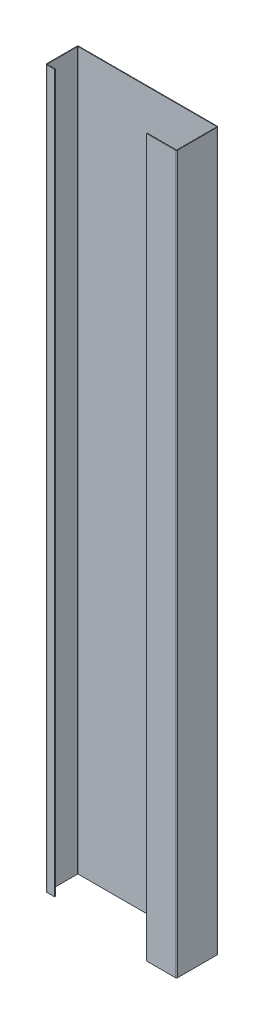
ISO-10303-21;
HEADER;
FILE_DESCRIPTION(('STEP AP214'),'2;1');
FILE_NAME('part.step','',(''),(''),'','','');
FILE_SCHEMA(('AUTOMOTIVE_DESIGN { 1 0 10303 214 1 1 1 1 }'));
ENDSEC;
DATA;
#1=APPLICATION_CONTEXT('core data for automotive mechanical design processes');
#2=APPLICATION_PROTOCOL_DEFINITION('international standard','automotive_design',2000,#1);
#3=PRODUCT_CONTEXT('',#1,'mechanical');
#4=PRODUCT('Part','Part','',(#3));
#5=PRODUCT_RELATED_PRODUCT_CATEGORY('part','',(#4));
#6=PRODUCT_DEFINITION_FORMATION('','',#4);
#7=PRODUCT_DEFINITION_CONTEXT('part definition',#1,'design');
#8=PRODUCT_DEFINITION('design','',#6,#7);
#9=PRODUCT_DEFINITION_SHAPE('','',#8);
#10=(LENGTH_UNIT() NAMED_UNIT(*) SI_UNIT(.MILLI.,.METRE.));
#11=(NAMED_UNIT(*) PLANE_ANGLE_UNIT() SI_UNIT($,.RADIAN.));
#12=(NAMED_UNIT(*) SI_UNIT($,.STERADIAN.) SOLID_ANGLE_UNIT());
#13=UNCERTAINTY_MEASURE_WITH_UNIT(LENGTH_MEASURE(1.E-05),#10,'distance_accuracy_value','');
#14=(GEOMETRIC_REPRESENTATION_CONTEXT(3) GLOBAL_UNCERTAINTY_ASSIGNED_CONTEXT((#13)) GLOBAL_UNIT_ASSIGNED_CONTEXT((#10,
#11,#12)) REPRESENTATION_CONTEXT('',''));
#15=CARTESIAN_POINT('',(0.,0.,0.));
#16=DIRECTION('',(0.,0.,1.));
#17=DIRECTION('',(1.,0.,0.));
#18=AXIS2_PLACEMENT_3D('',#15,#16,#17);
#19=CARTESIAN_POINT('',(0.,0.,-1.));
#20=DIRECTION('',(0.,0.,1.));
#21=DIRECTION('',(1.,0.,0.));
#22=AXIS2_PLACEMENT_3D('',#19,#20,#21);
#23=PLANE('',#22);
#24=DIRECTION('',(0.,1.,0.));
#25=VECTOR('',#24,1.);
#26=CARTESIAN_POINT('',(-905.132238629283,1863.16199376947,-0.999999999999897));
#27=LINE('',#26,#25);
#28=CARTESIAN_POINT('',(-905.132238629283,1863.16199376947,-0.999999999999897));
#29=VERTEX_POINT('',#28);
#30=CARTESIAN_POINT('',(-905.132238629283,663.16199376947,-1.));
#31=VERTEX_POINT('',#30);
#32=EDGE_CURVE('E347',#29,#31,#27,.F.);
#33=ORIENTED_EDGE('',*,*,#32,.T.);
#34=DIRECTION('',(1.,0.,0.));
#35=VECTOR('',#34,1.);
#36=CARTESIAN_POINT('',(-1138.39563862928,663.16199376947,-1.));
#37=LINE('',#36,#35);
#38=CARTESIAN_POINT('',(-1136.65903862928,663.16199376947,-1.));
#39=VERTEX_POINT('',#38);
#40=EDGE_CURVE('E130',#39,#31,#37,.T.);
#41=ORIENTED_EDGE('',*,*,#40,.F.);
#42=DIRECTION('',(0.,-1.,0.));
#43=VECTOR('',#42,1.);
#44=CARTESIAN_POINT('',(-1136.65903862928,663.16199376947,-1.));
#45=LINE('',#44,#43);
#46=CARTESIAN_POINT('',(-1136.65903862928,1863.16199376947,-1.));
#47=VERTEX_POINT('',#46);
#48=EDGE_CURVE('E443',#39,#47,#45,.F.);
#49=ORIENTED_EDGE('',*,*,#48,.T.);
#50=DIRECTION('',(-1.,0.,0.));
#51=VECTOR('',#50,1.);
#52=CARTESIAN_POINT('',(-1138.39563862928,1863.16199376947,-1.));
#53=LINE('',#52,#51);
#54=EDGE_CURVE('E13',#29,#47,#53,.T.);
#55=ORIENTED_EDGE('',*,*,#54,.F.);
#56=EDGE_LOOP('',(#33,#41,#49,#55));
#57=FACE_BOUND('',#56,.T.);
#58=ADVANCED_FACE('F121',(#57),#23,.F.);
#59=CARTESIAN_POINT('',(0.,0.,0.));
#60=DIRECTION('',(0.,0.,1.));
#61=DIRECTION('',(1.,0.,0.));
#62=AXIS2_PLACEMENT_3D('',#59,#60,#61);
#63=PLANE('',#62);
#64=DIRECTION('',(1.,0.,0.));
#65=VECTOR('',#64,1.);
#66=CARTESIAN_POINT('',(-1138.39563862928,663.16199376947,0.));
#67=LINE('',#66,#65);
#68=CARTESIAN_POINT('',(-1136.65903862928,663.16199376947,0.));
#69=VERTEX_POINT('',#68);
#70=CARTESIAN_POINT('',(-905.132238629283,663.16199376947,0.));
#71=VERTEX_POINT('',#70);
#72=EDGE_CURVE('E461',#69,#71,#67,.T.);
#73=ORIENTED_EDGE('',*,*,#72,.T.);
#74=DIRECTION('',(0.,1.,0.));
#75=VECTOR('',#74,1.);
#76=CARTESIAN_POINT('',(-905.132238629283,1863.16199376947,1.03432887255117E-13));
#77=LINE('',#76,#75);
#78=CARTESIAN_POINT('',(-905.132238629283,1863.16199376947,1.03432887255117E-13));
#79=VERTEX_POINT('',#78);
#80=EDGE_CURVE('E359',#79,#71,#77,.F.);
#81=ORIENTED_EDGE('',*,*,#80,.F.);
#82=DIRECTION('',(-1.,0.,0.));
#83=VECTOR('',#82,1.);
#84=CARTESIAN_POINT('',(-1138.39563862928,1863.16199376947,0.));
#85=LINE('',#84,#83);
#86=CARTESIAN_POINT('',(-1136.65903862928,1863.16199376947,0.));
#87=VERTEX_POINT('',#86);
#88=EDGE_CURVE('E125',#79,#87,#85,.T.);
#89=ORIENTED_EDGE('',*,*,#88,.T.);
#90=DIRECTION('',(0.,-1.,0.));
#91=VECTOR('',#90,1.);
#92=CARTESIAN_POINT('',(-1136.65903862928,663.16199376947,0.));
#93=LINE('',#92,#91);
#94=EDGE_CURVE('E138',#69,#87,#93,.F.);
#95=ORIENTED_EDGE('',*,*,#94,.F.);
#96=EDGE_LOOP('',(#73,#81,#89,#95));
#97=FACE_BOUND('',#96,.T.);
#98=ADVANCED_FACE('F466',(#97),#63,.T.);
#99=CARTESIAN_POINT('',(-1138.39563862928,1863.16199376947,-1.));
#100=DIRECTION('',(0.,1.,0.));
#101=DIRECTION('',(0.,0.,1.));
#102=AXIS2_PLACEMENT_3D('',#99,#100,#101);
#103=PLANE('',#102);
#104=ORIENTED_EDGE('',*,*,#88,.F.);
#105=DIRECTION('',(0.,0.,-1.));
#106=VECTOR('',#105,1.);
#107=CARTESIAN_POINT('',(-905.132238629283,1863.16199376947,1.03432887255117E-13));
#108=LINE('',#107,#106);
#109=EDGE_CURVE('E353',#79,#29,#108,.T.);
#110=ORIENTED_EDGE('',*,*,#109,.T.);
#111=ORIENTED_EDGE('',*,*,#54,.T.);
#112=DIRECTION('',(0.,0.,-1.));
#113=VECTOR('',#112,1.);
#114=CARTESIAN_POINT('',(-1136.65903862928,1863.16199376947,0.));
#115=LINE('',#114,#113);
#116=EDGE_CURVE('E458',#87,#47,#115,.T.);
#117=ORIENTED_EDGE('',*,*,#116,.F.);
#118=EDGE_LOOP('',(#104,#110,#111,#117));
#119=FACE_BOUND('',#118,.T.);
#120=ADVANCED_FACE('F468',(#119),#103,.T.);
#121=CARTESIAN_POINT('',(-1138.39563862928,663.16199376947,-1.));
#122=DIRECTION('',(0.,-1.,0.));
#123=DIRECTION('',(0.,0.,-1.));
#124=AXIS2_PLACEMENT_3D('',#121,#122,#123);
#125=PLANE('',#124);
#126=DIRECTION('',(0.,0.,-1.));
#127=VECTOR('',#126,1.);
#128=CARTESIAN_POINT('',(-905.132238629283,663.16199376947,0.));
#129=LINE('',#128,#127);
#130=EDGE_CURVE('E364',#71,#31,#129,.T.);
#131=ORIENTED_EDGE('',*,*,#130,.F.);
#132=ORIENTED_EDGE('',*,*,#72,.F.);
#133=DIRECTION('',(0.,0.,-1.));
#134=VECTOR('',#133,1.);
#135=CARTESIAN_POINT('',(-1136.65903862928,663.16199376947,0.));
#136=LINE('',#135,#134);
#137=EDGE_CURVE('E449',#69,#39,#136,.T.);
#138=ORIENTED_EDGE('',*,*,#137,.T.);
#139=ORIENTED_EDGE('',*,*,#40,.T.);
#140=EDGE_LOOP('',(#131,#132,#138,#139));
#141=FACE_BOUND('',#140,.T.);
#142=ADVANCED_FACE('F123',(#141),#125,.T.);
#143=CARTESIAN_POINT('',(-1136.65903862928,1863.16199376947,0.736599999999976));
#144=DIRECTION('',(0.,1.,0.));
#145=DIRECTION('',(0.,0.,1.));
#146=AXIS2_PLACEMENT_3D('',#143,#144,#145);
#147=PLANE('',#146);
#148=DIRECTION('',(1.,0.,0.));
#149=VECTOR('',#148,1.);
#150=CARTESIAN_POINT('',(-1138.39563862928,1863.16199376947,0.736599999999976));
#151=LINE('',#150,#149);
#152=CARTESIAN_POINT('',(-1137.39563862928,1863.16199376947,0.736599999999976));
#153=VERTEX_POINT('',#152);
#154=CARTESIAN_POINT('',(-1138.39563862928,1863.16199376947,0.736599999999976));
#155=VERTEX_POINT('',#154);
#156=EDGE_CURVE('E402',#153,#155,#151,.F.);
#157=ORIENTED_EDGE('',*,*,#156,.F.);
#158=CARTESIAN_POINT('',(-1136.65903862928,1863.16199376947,0.736599999999976));
#159=DIRECTION('',(0.,-1.,0.));
#160=DIRECTION('',(0.,0.,-1.));
#161=AXIS2_PLACEMENT_3D('',#158,#159,#160);
#162=CIRCLE('',#161,0.736599999999976);
#163=EDGE_CURVE('E452',#87,#153,#162,.F.);
#164=ORIENTED_EDGE('',*,*,#163,.F.);
#165=ORIENTED_EDGE('',*,*,#116,.T.);
#166=CARTESIAN_POINT('',(-1136.65903862928,1863.16199376947,0.736599999999976));
#167=DIRECTION('',(0.,-1.,0.));
#168=DIRECTION('',(0.,0.,-1.));
#169=AXIS2_PLACEMENT_3D('',#166,#167,#168);
#170=CIRCLE('',#169,1.73659999999998);
#171=EDGE_CURVE('E445',#47,#155,#170,.F.);
#172=ORIENTED_EDGE('',*,*,#171,.T.);
#173=EDGE_LOOP('',(#157,#164,#165,#172));
#174=FACE_BOUND('',#173,.T.);
#175=ADVANCED_FACE('F476',(#174),#147,.T.);
#176=CARTESIAN_POINT('',(-1136.65903862928,663.16199376947,0.736599999999976));
#177=DIRECTION('',(0.,1.,0.));
#178=DIRECTION('',(0.,0.,1.));
#179=AXIS2_PLACEMENT_3D('',#176,#177,#178);
#180=PLANE('',#179);
#181=CARTESIAN_POINT('',(-1136.65903862928,663.16199376947,0.736599999999976));
#182=DIRECTION('',(0.,-1.,0.));
#183=DIRECTION('',(0.,0.,-1.));
#184=AXIS2_PLACEMENT_3D('',#181,#182,#183);
#185=CIRCLE('',#184,0.736599999999976);
#186=CARTESIAN_POINT('',(-1137.39563862928,663.16199376947,0.736599999999976));
#187=VERTEX_POINT('',#186);
#188=EDGE_CURVE('E413',#187,#69,#185,.T.);
#189=ORIENTED_EDGE('',*,*,#188,.F.);
#190=DIRECTION('',(1.,0.,0.));
#191=VECTOR('',#190,1.);
#192=CARTESIAN_POINT('',(-1137.39563862928,663.16199376947,0.736599999999976));
#193=LINE('',#192,#191);
#194=CARTESIAN_POINT('',(-1138.39563862928,663.16199376947,0.736599999999976));
#195=VERTEX_POINT('',#194);
#196=EDGE_CURVE('E436',#187,#195,#193,.F.);
#197=ORIENTED_EDGE('',*,*,#196,.T.);
#198=CARTESIAN_POINT('',(-1136.65903862928,663.16199376947,0.736599999999976));
#199=DIRECTION('',(0.,-1.,0.));
#200=DIRECTION('',(0.,0.,-1.));
#201=AXIS2_PLACEMENT_3D('',#198,#199,#200);
#202=CIRCLE('',#201,1.73659999999998);
#203=EDGE_CURVE('E446',#195,#39,#202,.T.);
#204=ORIENTED_EDGE('',*,*,#203,.T.);
#205=ORIENTED_EDGE('',*,*,#137,.F.);
#206=EDGE_LOOP('',(#189,#197,#204,#205));
#207=FACE_BOUND('',#206,.T.);
#208=ADVANCED_FACE('F537',(#207),#180,.F.);
#209=CARTESIAN_POINT('',(-1136.65903862928,663.16199376947,0.736599999999976));
#210=DIRECTION('',(0.,-1.,0.));
#211=DIRECTION('',(-1.,0.,0.));
#212=AXIS2_PLACEMENT_3D('',#209,#210,#211);
#213=CYLINDRICAL_SURFACE('',#212,1.73659999999998);
#214=ORIENTED_EDGE('',*,*,#48,.F.);
#215=ORIENTED_EDGE('',*,*,#203,.F.);
#216=DIRECTION('',(0.,-1.,0.));
#217=VECTOR('',#216,1.);
#218=CARTESIAN_POINT('',(-1138.39563862928,1863.16199376947,0.736599999999976));
#219=LINE('',#218,#217);
#220=EDGE_CURVE('E434',#195,#155,#219,.F.);
#221=ORIENTED_EDGE('',*,*,#220,.T.);
#222=ORIENTED_EDGE('',*,*,#171,.F.);
#223=EDGE_LOOP('',(#214,#215,#221,#222));
#224=FACE_BOUND('',#223,.T.);
#225=ADVANCED_FACE('F885',(#224),#213,.T.);
#226=CARTESIAN_POINT('',(-1136.65903862928,663.16199376947,0.736599999999976));
#227=DIRECTION('',(0.,-1.,0.));
#228=DIRECTION('',(-1.,0.,0.));
#229=AXIS2_PLACEMENT_3D('',#226,#227,#228);
#230=CYLINDRICAL_SURFACE('',#229,0.736599999999976);
#231=ORIENTED_EDGE('',*,*,#94,.T.);
#232=ORIENTED_EDGE('',*,*,#163,.T.);
#233=DIRECTION('',(0.,-1.,0.));
#234=VECTOR('',#233,1.);
#235=CARTESIAN_POINT('',(-1137.39563862928,1863.16199376947,0.736599999999976));
#236=LINE('',#235,#234);
#237=EDGE_CURVE('E439',#153,#187,#236,.T.);
#238=ORIENTED_EDGE('',*,*,#237,.T.);
#239=ORIENTED_EDGE('',*,*,#188,.T.);
#240=EDGE_LOOP('',(#231,#232,#238,#239));
#241=FACE_BOUND('',#240,.T.);
#242=ADVANCED_FACE('F473',(#241),#230,.F.);
#243=CARTESIAN_POINT('',(-1138.39563862928,663.16199376947,51.));
#244=DIRECTION('',(0.,1.,0.));
#245=DIRECTION('',(0.,0.,1.));
#246=AXIS2_PLACEMENT_3D('',#243,#244,#245);
#247=PLANE('',#246);
#248=ORIENTED_EDGE('',*,*,#196,.F.);
#249=DIRECTION('',(0.,0.,-1.));
#250=VECTOR('',#249,1.);
#251=CARTESIAN_POINT('',(-1137.39563862928,663.16199376947,51.));
#252=LINE('',#251,#250);
#253=CARTESIAN_POINT('',(-1137.39563862928,663.16199376947,51.));
#254=VERTEX_POINT('',#253);
#255=EDGE_CURVE('E431',#187,#254,#252,.F.);
#256=ORIENTED_EDGE('',*,*,#255,.T.);
#257=DIRECTION('',(1.,0.,0.));
#258=VECTOR('',#257,1.);
#259=CARTESIAN_POINT('',(-1138.39563862928,663.16199376947,51.));
#260=LINE('',#259,#258);
#261=CARTESIAN_POINT('',(-1138.39563862928,663.16199376947,51.));
#262=VERTEX_POINT('',#261);
#263=EDGE_CURVE('E411',#262,#254,#260,.T.);
#264=ORIENTED_EDGE('',*,*,#263,.F.);
#265=DIRECTION('',(0.,0.,1.));
#266=VECTOR('',#265,1.);
#267=CARTESIAN_POINT('',(-1138.39563862928,663.16199376947,2.8837936737168E-12));
#268=LINE('',#267,#266);
#269=EDGE_CURVE('E423',#195,#262,#268,.T.);
#270=ORIENTED_EDGE('',*,*,#269,.F.);
#271=EDGE_LOOP('',(#248,#256,#264,#270));
#272=FACE_BOUND('',#271,.T.);
#273=ADVANCED_FACE('F867',(#272),#247,.F.);
#274=CARTESIAN_POINT('',(-1138.39563862928,1863.16199376947,0.));
#275=DIRECTION('',(0.,-1.,0.));
#276=DIRECTION('',(0.,0.,-1.));
#277=AXIS2_PLACEMENT_3D('',#274,#275,#276);
#278=PLANE('',#277);
#279=ORIENTED_EDGE('',*,*,#156,.T.);
#280=DIRECTION('',(0.,0.,-1.));
#281=VECTOR('',#280,1.);
#282=CARTESIAN_POINT('',(-1138.39563862928,1863.16199376947,8.10837261312931E-12));
#283=LINE('',#282,#281);
#284=CARTESIAN_POINT('',(-1138.39563862928,1863.16199376947,51.));
#285=VERTEX_POINT('',#284);
#286=EDGE_CURVE('E417',#285,#155,#283,.T.);
#287=ORIENTED_EDGE('',*,*,#286,.F.);
#288=DIRECTION('',(1.,0.,0.));
#289=VECTOR('',#288,1.);
#290=CARTESIAN_POINT('',(-1138.39563862928,1863.16199376947,51.));
#291=LINE('',#290,#289);
#292=CARTESIAN_POINT('',(-1137.39563862928,1863.16199376947,51.));
#293=VERTEX_POINT('',#292);
#294=EDGE_CURVE('E414',#285,#293,#291,.T.);
#295=ORIENTED_EDGE('',*,*,#294,.T.);
#296=DIRECTION('',(0.,0.,1.));
#297=VECTOR('',#296,1.);
#298=CARTESIAN_POINT('',(-1137.39563862928,1863.16199376947,0.));
#299=LINE('',#298,#297);
#300=EDGE_CURVE('E426',#293,#153,#299,.F.);
#301=ORIENTED_EDGE('',*,*,#300,.T.);
#302=EDGE_LOOP('',(#279,#287,#295,#301));
#303=FACE_BOUND('',#302,.T.);
#304=ADVANCED_FACE('F479',(#303),#278,.F.);
#305=CARTESIAN_POINT('',(-1138.39563862928,-2.10645508189848E-13,0.));
#306=DIRECTION('',(1.,0.,0.));
#307=DIRECTION('',(0.,1.,0.));
#308=AXIS2_PLACEMENT_3D('',#305,#306,#307);
#309=PLANE('',#308);
#310=ORIENTED_EDGE('',*,*,#220,.F.);
#311=ORIENTED_EDGE('',*,*,#269,.T.);
#312=DIRECTION('',(0.,1.,0.));
#313=VECTOR('',#312,1.);
#314=CARTESIAN_POINT('',(-1138.39563862928,-2.10645508189848E-13,51.));
#315=LINE('',#314,#313);
#316=EDGE_CURVE('E420',#262,#285,#315,.T.);
#317=ORIENTED_EDGE('',*,*,#316,.T.);
#318=ORIENTED_EDGE('',*,*,#286,.T.);
#319=EDGE_LOOP('',(#310,#311,#317,#318));
#320=FACE_BOUND('',#319,.T.);
#321=ADVANCED_FACE('F483',(#320),#309,.F.);
#322=CARTESIAN_POINT('',(-1137.39563862928,-2.10460471019077E-13,0.));
#323=DIRECTION('',(1.,0.,0.));
#324=DIRECTION('',(0.,1.,0.));
#325=AXIS2_PLACEMENT_3D('',#322,#323,#324);
#326=PLANE('',#325);
#327=ORIENTED_EDGE('',*,*,#255,.F.);
#328=ORIENTED_EDGE('',*,*,#237,.F.);
#329=ORIENTED_EDGE('',*,*,#300,.F.);
#330=DIRECTION('',(0.,-1.,0.));
#331=VECTOR('',#330,1.);
#332=CARTESIAN_POINT('',(-1137.39563862928,1863.16199376947,51.));
#333=LINE('',#332,#331);
#334=EDGE_CURVE('E429',#254,#293,#333,.F.);
#335=ORIENTED_EDGE('',*,*,#334,.F.);
#336=EDGE_LOOP('',(#327,#328,#329,#335));
#337=FACE_BOUND('',#336,.T.);
#338=ADVANCED_FACE('F841',(#337),#326,.T.);
#339=CARTESIAN_POINT('',(-1136.65903862928,1863.16199376947,51.));
#340=DIRECTION('',(0.,1.,0.));
#341=DIRECTION('',(0.,0.,1.));
#342=AXIS2_PLACEMENT_3D('',#339,#340,#341);
#343=PLANE('',#342);
#344=DIRECTION('',(0.,0.,-1.));
#345=VECTOR('',#344,1.);
#346=CARTESIAN_POINT('',(-1136.65903862928,1863.16199376947,52.7366));
#347=LINE('',#346,#345);
#348=CARTESIAN_POINT('',(-1136.65903862928,1863.16199376947,51.7366));
#349=VERTEX_POINT('',#348);
#350=CARTESIAN_POINT('',(-1136.65903862928,1863.16199376947,52.7366));
#351=VERTEX_POINT('',#350);
#352=EDGE_CURVE('E367',#349,#351,#347,.F.);
#353=ORIENTED_EDGE('',*,*,#352,.F.);
#354=CARTESIAN_POINT('',(-1136.65903862928,1863.16199376947,51.));
#355=DIRECTION('',(0.,-1.,0.));
#356=DIRECTION('',(0.,0.,-1.));
#357=AXIS2_PLACEMENT_3D('',#354,#355,#356);
#358=CIRCLE('',#357,0.736599999999997);
#359=EDGE_CURVE('E406',#293,#349,#358,.F.);
#360=ORIENTED_EDGE('',*,*,#359,.F.);
#361=ORIENTED_EDGE('',*,*,#294,.F.);
#362=CARTESIAN_POINT('',(-1136.65903862928,1863.16199376947,51.));
#363=DIRECTION('',(0.,-1.,0.));
#364=DIRECTION('',(0.,0.,-1.));
#365=AXIS2_PLACEMENT_3D('',#362,#363,#364);
#366=CIRCLE('',#365,1.7366);
#367=EDGE_CURVE('E399',#285,#351,#366,.F.);
#368=ORIENTED_EDGE('',*,*,#367,.T.);
#369=EDGE_LOOP('',(#353,#360,#361,#368));
#370=FACE_BOUND('',#369,.T.);
#371=ADVANCED_FACE('F512',(#370),#343,.T.);
#372=CARTESIAN_POINT('',(-1136.65903862928,663.16199376947,51.));
#373=DIRECTION('',(0.,1.,0.));
#374=DIRECTION('',(0.,0.,1.));
#375=AXIS2_PLACEMENT_3D('',#372,#373,#374);
#376=PLANE('',#375);
#377=CARTESIAN_POINT('',(-1136.65903862928,663.16199376947,51.));
#378=DIRECTION('',(0.,-1.,0.));
#379=DIRECTION('',(0.,0.,-1.));
#380=AXIS2_PLACEMENT_3D('',#377,#378,#379);
#381=CIRCLE('',#380,0.736599999999997);
#382=CARTESIAN_POINT('',(-1136.65903862928,663.16199376947,51.7366));
#383=VERTEX_POINT('',#382);
#384=EDGE_CURVE('E372',#383,#254,#381,.T.);
#385=ORIENTED_EDGE('',*,*,#384,.F.);
#386=DIRECTION('',(0.,0.,-1.));
#387=VECTOR('',#386,1.);
#388=CARTESIAN_POINT('',(-1136.65903862928,663.16199376947,51.7365999999999));
#389=LINE('',#388,#387);
#390=CARTESIAN_POINT('',(-1136.65903862928,663.16199376947,52.7366));
#391=VERTEX_POINT('',#390);
#392=EDGE_CURVE('E392',#383,#391,#389,.F.);
#393=ORIENTED_EDGE('',*,*,#392,.T.);
#394=CARTESIAN_POINT('',(-1136.65903862928,663.16199376947,51.));
#395=DIRECTION('',(0.,-1.,0.));
#396=DIRECTION('',(0.,0.,-1.));
#397=AXIS2_PLACEMENT_3D('',#394,#395,#396);
#398=CIRCLE('',#397,1.7366);
#399=EDGE_CURVE('E403',#391,#262,#398,.T.);
#400=ORIENTED_EDGE('',*,*,#399,.T.);
#401=ORIENTED_EDGE('',*,*,#263,.T.);
#402=EDGE_LOOP('',(#385,#393,#400,#401));
#403=FACE_BOUND('',#402,.T.);
#404=ADVANCED_FACE('F491',(#403),#376,.F.);
#405=CARTESIAN_POINT('',(-1136.65903862928,663.16199376947,51.));
#406=DIRECTION('',(0.,-1.,0.));
#407=DIRECTION('',(0.,0.,1.));
#408=AXIS2_PLACEMENT_3D('',#405,#406,#407);
#409=CYLINDRICAL_SURFACE('',#408,1.7366);
#410=ORIENTED_EDGE('',*,*,#316,.F.);
#411=ORIENTED_EDGE('',*,*,#399,.F.);
#412=DIRECTION('',(0.,-1.,0.));
#413=VECTOR('',#412,1.);
#414=CARTESIAN_POINT('',(-1136.65903862928,1863.16199376947,52.7366));
#415=LINE('',#414,#413);
#416=EDGE_CURVE('E390',#391,#351,#415,.F.);
#417=ORIENTED_EDGE('',*,*,#416,.T.);
#418=ORIENTED_EDGE('',*,*,#367,.F.);
#419=EDGE_LOOP('',(#410,#411,#417,#418));
#420=FACE_BOUND('',#419,.T.);
#421=ADVANCED_FACE('F487',(#420),#409,.T.);
#422=CARTESIAN_POINT('',(-1136.65903862928,663.16199376947,51.));
#423=DIRECTION('',(0.,-1.,0.));
#424=DIRECTION('',(0.,0.,1.));
#425=AXIS2_PLACEMENT_3D('',#422,#423,#424);
#426=CYLINDRICAL_SURFACE('',#425,0.736599999999997);
#427=ORIENTED_EDGE('',*,*,#334,.T.);
#428=ORIENTED_EDGE('',*,*,#359,.T.);
#429=DIRECTION('',(0.,-1.,0.));
#430=VECTOR('',#429,1.);
#431=CARTESIAN_POINT('',(-1136.65903862928,1863.16199376947,51.7366));
#432=LINE('',#431,#430);
#433=EDGE_CURVE('E395',#349,#383,#432,.T.);
#434=ORIENTED_EDGE('',*,*,#433,.T.);
#435=ORIENTED_EDGE('',*,*,#384,.T.);
#436=EDGE_LOOP('',(#427,#428,#434,#435));
#437=FACE_BOUND('',#436,.T.);
#438=ADVANCED_FACE('F515',(#437),#426,.F.);
#439=CARTESIAN_POINT('',(-1123.39563862928,663.16199376947,52.7366));
#440=DIRECTION('',(0.,1.,0.));
#441=DIRECTION('',(0.,0.,1.));
#442=AXIS2_PLACEMENT_3D('',#439,#440,#441);
#443=PLANE('',#442);
#444=ORIENTED_EDGE('',*,*,#392,.F.);
#445=DIRECTION('',(-1.,0.,0.));
#446=VECTOR('',#445,1.);
#447=CARTESIAN_POINT('',(-1123.39563862928,663.16199376947,51.7366));
#448=LINE('',#447,#446);
#449=CARTESIAN_POINT('',(-1123.39563862928,663.16199376947,51.7366));
#450=VERTEX_POINT('',#449);
#451=EDGE_CURVE('E388',#383,#450,#448,.F.);
#452=ORIENTED_EDGE('',*,*,#451,.T.);
#453=DIRECTION('',(0.,0.,-1.));
#454=VECTOR('',#453,1.);
#455=CARTESIAN_POINT('',(-1123.39563862928,663.16199376947,52.7366));
#456=LINE('',#455,#454);
#457=CARTESIAN_POINT('',(-1123.39563862928,663.16199376947,52.7366));
#458=VERTEX_POINT('',#457);
#459=EDGE_CURVE('E369',#458,#450,#456,.T.);
#460=ORIENTED_EDGE('',*,*,#459,.F.);
#461=DIRECTION('',(1.,0.,0.));
#462=VECTOR('',#461,1.);
#463=CARTESIAN_POINT('',(-1.80433275888491E-13,663.16199376947,52.7366000000039));
#464=LINE('',#463,#462);
#465=EDGE_CURVE('E381',#391,#458,#464,.T.);
#466=ORIENTED_EDGE('',*,*,#465,.F.);
#467=EDGE_LOOP('',(#444,#452,#460,#466));
#468=FACE_BOUND('',#467,.T.);
#469=ADVANCED_FACE('F501',(#468),#443,.F.);
#470=CARTESIAN_POINT('',(-1137.39563862928,1863.16199376947,52.7366));
#471=DIRECTION('',(0.,-1.,0.));
#472=DIRECTION('',(0.,0.,-1.));
#473=AXIS2_PLACEMENT_3D('',#470,#471,#472);
#474=PLANE('',#473);
#475=ORIENTED_EDGE('',*,*,#352,.T.);
#476=DIRECTION('',(-1.,0.,0.));
#477=VECTOR('',#476,1.);
#478=CARTESIAN_POINT('',(-1.80433275888491E-13,1863.16199376947,52.7366000000039));
#479=LINE('',#478,#477);
#480=CARTESIAN_POINT('',(-1123.39563862928,1863.16199376947,52.7366));
#481=VERTEX_POINT('',#480);
#482=EDGE_CURVE('E376',#481,#351,#479,.T.);
#483=ORIENTED_EDGE('',*,*,#482,.F.);
#484=DIRECTION('',(0.,0.,-1.));
#485=VECTOR('',#484,1.);
#486=CARTESIAN_POINT('',(-1123.39563862928,1863.16199376947,52.7366));
#487=LINE('',#486,#485);
#488=CARTESIAN_POINT('',(-1123.39563862928,1863.16199376947,51.7366));
#489=VERTEX_POINT('',#488);
#490=EDGE_CURVE('E373',#481,#489,#487,.T.);
#491=ORIENTED_EDGE('',*,*,#490,.T.);
#492=DIRECTION('',(1.,0.,0.));
#493=VECTOR('',#492,1.);
#494=CARTESIAN_POINT('',(-1137.39563862928,1863.16199376947,51.7366));
#495=LINE('',#494,#493);
#496=EDGE_CURVE('E383',#489,#349,#495,.F.);
#497=ORIENTED_EDGE('',*,*,#496,.T.);
#498=EDGE_LOOP('',(#475,#483,#491,#497));
#499=FACE_BOUND('',#498,.T.);
#500=ADVANCED_FACE('F509',(#499),#474,.F.);
#501=CARTESIAN_POINT('',(-1.80433275888491E-13,0.,52.7366000000039));
#502=DIRECTION('',(0.,0.,-1.));
#503=DIRECTION('',(-1.,0.,0.));
#504=AXIS2_PLACEMENT_3D('',#501,#502,#503);
#505=PLANE('',#504);
#506=ORIENTED_EDGE('',*,*,#416,.F.);
#507=ORIENTED_EDGE('',*,*,#465,.T.);
#508=DIRECTION('',(0.,1.,0.));
#509=VECTOR('',#508,1.);
#510=CARTESIAN_POINT('',(-1123.39563862928,-2.07869950628285E-13,52.7366));
#511=LINE('',#510,#509);
#512=EDGE_CURVE('E379',#458,#481,#511,.T.);
#513=ORIENTED_EDGE('',*,*,#512,.T.);
#514=ORIENTED_EDGE('',*,*,#482,.T.);
#515=EDGE_LOOP('',(#506,#507,#513,#514));
#516=FACE_BOUND('',#515,.T.);
#517=ADVANCED_FACE('F498',(#516),#505,.F.);
#518=CARTESIAN_POINT('',(-1.76941794549648E-13,0.,51.7366000000039));
#519=DIRECTION('',(0.,0.,-1.));
#520=DIRECTION('',(-1.,0.,0.));
#521=AXIS2_PLACEMENT_3D('',#518,#519,#520);
#522=PLANE('',#521);
#523=ORIENTED_EDGE('',*,*,#451,.F.);
#524=ORIENTED_EDGE('',*,*,#433,.F.);
#525=ORIENTED_EDGE('',*,*,#496,.F.);
#526=DIRECTION('',(0.,-1.,0.));
#527=VECTOR('',#526,1.);
#528=CARTESIAN_POINT('',(-1123.39563862928,1863.16199376947,51.7366));
#529=LINE('',#528,#527);
#530=EDGE_CURVE('E386',#450,#489,#529,.F.);
#531=ORIENTED_EDGE('',*,*,#530,.F.);
#532=EDGE_LOOP('',(#523,#524,#525,#531));
#533=FACE_BOUND('',#532,.T.);
#534=ADVANCED_FACE('F518',(#533),#522,.T.);
#535=CARTESIAN_POINT('',(-1123.39563862928,1863.16199376947,52.7366));
#536=DIRECTION('',(-1.,0.,0.));
#537=DIRECTION('',(0.,0.,1.));
#538=AXIS2_PLACEMENT_3D('',#535,#536,#537);
#539=PLANE('',#538);
#540=ORIENTED_EDGE('',*,*,#530,.T.);
#541=ORIENTED_EDGE('',*,*,#490,.F.);
#542=ORIENTED_EDGE('',*,*,#512,.F.);
#543=ORIENTED_EDGE('',*,*,#459,.T.);
#544=EDGE_LOOP('',(#540,#541,#542,#543));
#545=FACE_BOUND('',#544,.T.);
#546=ADVANCED_FACE('F506',(#545),#539,.F.);
#547=CARTESIAN_POINT('',(-905.132238629283,663.16199376947,0.736599999999991));
#548=DIRECTION('',(0.,-1.,0.));
#549=DIRECTION('',(0.,0.,-1.));
#550=AXIS2_PLACEMENT_3D('',#547,#548,#549);
#551=PLANE('',#550);
#552=DIRECTION('',(-1.,0.,0.));
#553=VECTOR('',#552,1.);
#554=CARTESIAN_POINT('',(-903.395638629283,663.16199376947,0.736599999999971));
#555=LINE('',#554,#553);
#556=CARTESIAN_POINT('',(-904.395638629283,663.16199376947,0.736599999999988));
#557=VERTEX_POINT('',#556);
#558=CARTESIAN_POINT('',(-903.395638629283,663.16199376947,0.736599999999982));
#559=VERTEX_POINT('',#558);
#560=EDGE_CURVE('E305',#557,#559,#555,.F.);
#561=ORIENTED_EDGE('',*,*,#560,.F.);
#562=CARTESIAN_POINT('',(-905.132238629283,663.16199376947,0.736599999999991));
#563=DIRECTION('',(0.,1.,0.));
#564=DIRECTION('',(0.,0.,1.));
#565=AXIS2_PLACEMENT_3D('',#562,#563,#564);
#566=CIRCLE('',#565,0.736599999999976);
#567=EDGE_CURVE('E356',#71,#557,#566,.F.);
#568=ORIENTED_EDGE('',*,*,#567,.F.);
#569=ORIENTED_EDGE('',*,*,#130,.T.);
#570=CARTESIAN_POINT('',(-905.132238629283,663.16199376947,0.736599999999991));
#571=DIRECTION('',(0.,1.,0.));
#572=DIRECTION('',(0.,0.,1.));
#573=AXIS2_PLACEMENT_3D('',#570,#571,#572);
#574=CIRCLE('',#573,1.73659999999998);
#575=EDGE_CURVE('E349',#31,#559,#574,.F.);
#576=ORIENTED_EDGE('',*,*,#575,.T.);
#577=EDGE_LOOP('',(#561,#568,#569,#576));
#578=FACE_BOUND('',#577,.T.);
#579=ADVANCED_FACE('F525',(#578),#551,.T.);
#580=CARTESIAN_POINT('',(-905.132238629283,1863.16199376947,0.73660000000008));
#581=DIRECTION('',(0.,-1.,0.));
#582=DIRECTION('',(0.,0.,-1.));
#583=AXIS2_PLACEMENT_3D('',#580,#581,#582);
#584=PLANE('',#583);
#585=CARTESIAN_POINT('',(-905.132238629283,1863.16199376947,0.73660000000008));
#586=DIRECTION('',(0.,1.,0.));
#587=DIRECTION('',(0.,0.,1.));
#588=AXIS2_PLACEMENT_3D('',#585,#586,#587);
#589=CIRCLE('',#588,0.736599999999976);
#590=CARTESIAN_POINT('',(-904.395638629283,1863.16199376947,0.736600000000076));
#591=VERTEX_POINT('',#590);
#592=EDGE_CURVE('E317',#591,#79,#589,.T.);
#593=ORIENTED_EDGE('',*,*,#592,.F.);
#594=DIRECTION('',(-1.,0.,0.));
#595=VECTOR('',#594,1.);
#596=CARTESIAN_POINT('',(-904.395638629283,1863.16199376947,0.736600000000087));
#597=LINE('',#596,#595);
#598=CARTESIAN_POINT('',(-903.395638629283,1863.16199376947,0.736600000000082));
#599=VERTEX_POINT('',#598);
#600=EDGE_CURVE('E340',#591,#599,#597,.F.);
#601=ORIENTED_EDGE('',*,*,#600,.T.);
#602=CARTESIAN_POINT('',(-905.132238629283,1863.16199376947,0.73660000000008));
#603=DIRECTION('',(0.,1.,0.));
#604=DIRECTION('',(0.,0.,1.));
#605=AXIS2_PLACEMENT_3D('',#602,#603,#604);
#606=CIRCLE('',#605,1.73659999999998);
#607=EDGE_CURVE('E350',#599,#29,#606,.T.);
#608=ORIENTED_EDGE('',*,*,#607,.T.);
#609=ORIENTED_EDGE('',*,*,#109,.F.);
#610=EDGE_LOOP('',(#593,#601,#608,#609));
#611=FACE_BOUND('',#610,.T.);
#612=ADVANCED_FACE('F608',(#611),#584,.F.);
#613=CARTESIAN_POINT('',(-905.132238629283,1863.16199376947,0.73660000000008));
#614=DIRECTION('',(0.,1.,0.));
#615=DIRECTION('',(1.,0.,0.));
#616=AXIS2_PLACEMENT_3D('',#613,#614,#615);
#617=CYLINDRICAL_SURFACE('',#616,1.73659999999998);
#618=ORIENTED_EDGE('',*,*,#32,.F.);
#619=ORIENTED_EDGE('',*,*,#607,.F.);
#620=DIRECTION('',(0.,1.,0.));
#621=VECTOR('',#620,1.);
#622=CARTESIAN_POINT('',(-903.395638629283,663.16199376947,0.736599999999971));
#623=LINE('',#622,#621);
#624=EDGE_CURVE('E338',#599,#559,#623,.F.);
#625=ORIENTED_EDGE('',*,*,#624,.T.);
#626=ORIENTED_EDGE('',*,*,#575,.F.);
#627=EDGE_LOOP('',(#618,#619,#625,#626));
#628=FACE_BOUND('',#627,.T.);
#629=ADVANCED_FACE('F553',(#628),#617,.T.);
#630=CARTESIAN_POINT('',(-905.132238629283,1863.16199376947,0.73660000000008));
#631=DIRECTION('',(0.,1.,0.));
#632=DIRECTION('',(1.,0.,0.));
#633=AXIS2_PLACEMENT_3D('',#630,#631,#632);
#634=CYLINDRICAL_SURFACE('',#633,0.736599999999976);
#635=ORIENTED_EDGE('',*,*,#80,.T.);
#636=ORIENTED_EDGE('',*,*,#567,.T.);
#637=DIRECTION('',(0.,1.,0.));
#638=VECTOR('',#637,1.);
#639=CARTESIAN_POINT('',(-904.395638629283,663.16199376947,0.736599999999976));
#640=LINE('',#639,#638);
#641=EDGE_CURVE('E343',#557,#591,#640,.T.);
#642=ORIENTED_EDGE('',*,*,#641,.T.);
#643=ORIENTED_EDGE('',*,*,#592,.T.);
#644=EDGE_LOOP('',(#635,#636,#642,#643));
#645=FACE_BOUND('',#644,.T.);
#646=ADVANCED_FACE('F588',(#645),#634,.F.);
#647=CARTESIAN_POINT('',(-903.395638629283,663.16199376947,0.));
#648=DIRECTION('',(0.,1.,0.));
#649=DIRECTION('',(0.,0.,1.));
#650=AXIS2_PLACEMENT_3D('',#647,#648,#649);
#651=PLANE('',#650);
#652=ORIENTED_EDGE('',*,*,#560,.T.);
#653=DIRECTION('',(0.,0.,-1.));
#654=VECTOR('',#653,1.);
#655=CARTESIAN_POINT('',(-903.395638629283,663.16199376947,5.58631393596821E-12));
#656=LINE('',#655,#654);
#657=CARTESIAN_POINT('',(-903.395638629283,663.16199376947,67.));
#658=VERTEX_POINT('',#657);
#659=EDGE_CURVE('E327',#658,#559,#656,.T.);
#660=ORIENTED_EDGE('',*,*,#659,.F.);
#661=DIRECTION('',(-1.,0.,0.));
#662=VECTOR('',#661,1.);
#663=CARTESIAN_POINT('',(-903.395638629283,663.16199376947,67.));
#664=LINE('',#663,#662);
#665=CARTESIAN_POINT('',(-904.395638629283,663.16199376947,67.));
#666=VERTEX_POINT('',#665);
#667=EDGE_CURVE('E318',#658,#666,#664,.T.);
#668=ORIENTED_EDGE('',*,*,#667,.T.);
#669=DIRECTION('',(0.,0.,1.));
#670=VECTOR('',#669,1.);
#671=CARTESIAN_POINT('',(-904.395638629283,663.16199376947,0.));
#672=LINE('',#671,#670);
#673=EDGE_CURVE('E335',#666,#557,#672,.F.);
#674=ORIENTED_EDGE('',*,*,#673,.T.);
#675=EDGE_LOOP('',(#652,#660,#668,#674));
#676=FACE_BOUND('',#675,.T.);
#677=ADVANCED_FACE('F585',(#676),#651,.F.);
#678=CARTESIAN_POINT('',(-903.395638629283,1863.16199376947,67.));
#679=DIRECTION('',(0.,-1.,0.));
#680=DIRECTION('',(1.,0.,0.));
#681=AXIS2_PLACEMENT_3D('',#678,#679,#680);
#682=PLANE('',#681);
#683=ORIENTED_EDGE('',*,*,#600,.F.);
#684=DIRECTION('',(0.,0.,-1.));
#685=VECTOR('',#684,1.);
#686=CARTESIAN_POINT('',(-904.395638629283,1863.16199376947,67.));
#687=LINE('',#686,#685);
#688=CARTESIAN_POINT('',(-904.395638629283,1863.16199376947,67.));
#689=VERTEX_POINT('',#688);
#690=EDGE_CURVE('E332',#591,#689,#687,.F.);
#691=ORIENTED_EDGE('',*,*,#690,.T.);
#692=DIRECTION('',(-1.,0.,0.));
#693=VECTOR('',#692,1.);
#694=CARTESIAN_POINT('',(-903.395638629283,1863.16199376947,67.));
#695=LINE('',#694,#693);
#696=CARTESIAN_POINT('',(-903.395638629283,1863.16199376947,67.));
#697=VERTEX_POINT('',#696);
#698=EDGE_CURVE('E315',#697,#689,#695,.T.);
#699=ORIENTED_EDGE('',*,*,#698,.F.);
#700=DIRECTION('',(0.,0.,1.));
#701=VECTOR('',#700,1.);
#702=CARTESIAN_POINT('',(-903.395638629283,1863.16199376947,4.48742182471568E-12));
#703=LINE('',#702,#701);
#704=EDGE_CURVE('E324',#599,#697,#703,.T.);
#705=ORIENTED_EDGE('',*,*,#704,.F.);
#706=EDGE_LOOP('',(#683,#691,#699,#705));
#707=FACE_BOUND('',#706,.T.);
#708=ADVANCED_FACE('F562',(#707),#682,.F.);
#709=CARTESIAN_POINT('',(-903.395638629283,0.,4.48742182471568E-12));
#710=DIRECTION('',(-1.,0.,0.));
#711=DIRECTION('',(0.,0.,1.));
#712=AXIS2_PLACEMENT_3D('',#709,#710,#711);
#713=PLANE('',#712);
#714=ORIENTED_EDGE('',*,*,#624,.F.);
#715=ORIENTED_EDGE('',*,*,#704,.T.);
#716=DIRECTION('',(0.,-1.,0.));
#717=VECTOR('',#716,1.);
#718=CARTESIAN_POINT('',(-903.395638629283,0.,67.));
#719=LINE('',#718,#717);
#720=EDGE_CURVE('E321',#697,#658,#719,.T.);
#721=ORIENTED_EDGE('',*,*,#720,.T.);
#722=ORIENTED_EDGE('',*,*,#659,.T.);
#723=EDGE_LOOP('',(#714,#715,#721,#722));
#724=FACE_BOUND('',#723,.T.);
#725=ADVANCED_FACE('F557',(#724),#713,.F.);
#726=CARTESIAN_POINT('',(-904.395638629283,0.,4.49091330605453E-12));
#727=DIRECTION('',(-1.,0.,0.));
#728=DIRECTION('',(0.,0.,1.));
#729=AXIS2_PLACEMENT_3D('',#726,#727,#728);
#730=PLANE('',#729);
#731=ORIENTED_EDGE('',*,*,#690,.F.);
#732=ORIENTED_EDGE('',*,*,#641,.F.);
#733=ORIENTED_EDGE('',*,*,#673,.F.);
#734=DIRECTION('',(0.,1.,0.));
#735=VECTOR('',#734,1.);
#736=CARTESIAN_POINT('',(-904.395638629283,663.16199376947,67.));
#737=LINE('',#736,#735);
#738=EDGE_CURVE('E330',#689,#666,#737,.F.);
#739=ORIENTED_EDGE('',*,*,#738,.F.);
#740=EDGE_LOOP('',(#731,#732,#733,#739));
#741=FACE_BOUND('',#740,.T.);
#742=ADVANCED_FACE('F591',(#741),#730,.T.);
#743=CARTESIAN_POINT('',(-905.132238629283,663.16199376947,67.));
#744=DIRECTION('',(0.,-1.,0.));
#745=DIRECTION('',(0.,0.,-1.));
#746=AXIS2_PLACEMENT_3D('',#743,#744,#745);
#747=PLANE('',#746);
#748=DIRECTION('',(0.,0.,-1.));
#749=VECTOR('',#748,1.);
#750=CARTESIAN_POINT('',(-905.132238629283,663.16199376947,68.7366));
#751=LINE('',#750,#749);
#752=CARTESIAN_POINT('',(-905.132238629283,663.16199376947,67.7366));
#753=VERTEX_POINT('',#752);
#754=CARTESIAN_POINT('',(-905.132238629283,663.16199376947,68.7366));
#755=VERTEX_POINT('',#754);
#756=EDGE_CURVE('E284',#753,#755,#751,.F.);
#757=ORIENTED_EDGE('',*,*,#756,.F.);
#758=CARTESIAN_POINT('',(-905.132238629283,663.16199376947,67.));
#759=DIRECTION('',(0.,1.,0.));
#760=DIRECTION('',(0.,0.,1.));
#761=AXIS2_PLACEMENT_3D('',#758,#759,#760);
#762=CIRCLE('',#761,0.736600000000004);
#763=EDGE_CURVE('E309',#666,#753,#762,.F.);
#764=ORIENTED_EDGE('',*,*,#763,.F.);
#765=ORIENTED_EDGE('',*,*,#667,.F.);
#766=CARTESIAN_POINT('',(-905.132238629283,663.16199376947,67.));
#767=DIRECTION('',(0.,1.,0.));
#768=DIRECTION('',(0.,0.,1.));
#769=AXIS2_PLACEMENT_3D('',#766,#767,#768);
#770=CIRCLE('',#769,1.7366);
#771=EDGE_CURVE('E302',#658,#755,#770,.F.);
#772=ORIENTED_EDGE('',*,*,#771,.T.);
#773=EDGE_LOOP('',(#757,#764,#765,#772));
#774=FACE_BOUND('',#773,.T.);
#775=ADVANCED_FACE('F582',(#774),#747,.T.);
#776=CARTESIAN_POINT('',(-905.132238629283,1863.16199376947,67.));
#777=DIRECTION('',(0.,-1.,0.));
#778=DIRECTION('',(0.,0.,-1.));
#779=AXIS2_PLACEMENT_3D('',#776,#777,#778);
#780=PLANE('',#779);
#781=CARTESIAN_POINT('',(-905.132238629283,1863.16199376947,67.));
#782=DIRECTION('',(0.,1.,0.));
#783=DIRECTION('',(0.,0.,1.));
#784=AXIS2_PLACEMENT_3D('',#781,#782,#783);
#785=CIRCLE('',#784,0.736600000000004);
#786=CARTESIAN_POINT('',(-905.132238629283,1863.16199376947,67.7366));
#787=VERTEX_POINT('',#786);
#788=EDGE_CURVE('E312',#787,#689,#785,.T.);
#789=ORIENTED_EDGE('',*,*,#788,.F.);
#790=DIRECTION('',(0.,0.,-1.));
#791=VECTOR('',#790,1.);
#792=CARTESIAN_POINT('',(-905.132238629283,1863.16199376947,67.7366));
#793=LINE('',#792,#791);
#794=CARTESIAN_POINT('',(-905.132238629283,1863.16199376947,68.7366));
#795=VERTEX_POINT('',#794);
#796=EDGE_CURVE('E296',#787,#795,#793,.F.);
#797=ORIENTED_EDGE('',*,*,#796,.T.);
#798=CARTESIAN_POINT('',(-905.132238629283,1863.16199376947,67.));
#799=DIRECTION('',(0.,1.,0.));
#800=DIRECTION('',(0.,0.,1.));
#801=AXIS2_PLACEMENT_3D('',#798,#799,#800);
#802=CIRCLE('',#801,1.7366);
#803=EDGE_CURVE('E306',#795,#697,#802,.T.);
#804=ORIENTED_EDGE('',*,*,#803,.T.);
#805=ORIENTED_EDGE('',*,*,#698,.T.);
#806=EDGE_LOOP('',(#789,#797,#804,#805));
#807=FACE_BOUND('',#806,.T.);
#808=ADVANCED_FACE('F567',(#807),#780,.F.);
#809=CARTESIAN_POINT('',(-905.132238629283,1863.16199376947,67.));
#810=DIRECTION('',(0.,1.,0.));
#811=DIRECTION('',(0.,0.,1.));
#812=AXIS2_PLACEMENT_3D('',#809,#810,#811);
#813=CYLINDRICAL_SURFACE('',#812,1.7366);
#814=ORIENTED_EDGE('',*,*,#720,.F.);
#815=ORIENTED_EDGE('',*,*,#803,.F.);
#816=DIRECTION('',(0.,1.,0.));
#817=VECTOR('',#816,1.);
#818=CARTESIAN_POINT('',(-905.132238629283,663.16199376947,68.7366));
#819=LINE('',#818,#817);
#820=EDGE_CURVE('E294',#795,#755,#819,.F.);
#821=ORIENTED_EDGE('',*,*,#820,.T.);
#822=ORIENTED_EDGE('',*,*,#771,.F.);
#823=EDGE_LOOP('',(#814,#815,#821,#822));
#824=FACE_BOUND('',#823,.T.);
#825=ADVANCED_FACE('F579',(#824),#813,.T.);
#826=CARTESIAN_POINT('',(-905.132238629283,1863.16199376947,67.));
#827=DIRECTION('',(0.,1.,0.));
#828=DIRECTION('',(0.,0.,1.));
#829=AXIS2_PLACEMENT_3D('',#826,#827,#828);
#830=CYLINDRICAL_SURFACE('',#829,0.736600000000004);
#831=ORIENTED_EDGE('',*,*,#738,.T.);
#832=ORIENTED_EDGE('',*,*,#763,.T.);
#833=DIRECTION('',(0.,1.,0.));
#834=VECTOR('',#833,1.);
#835=CARTESIAN_POINT('',(-905.132238629283,663.16199376947,67.7366));
#836=LINE('',#835,#834);
#837=EDGE_CURVE('E299',#753,#787,#836,.T.);
#838=ORIENTED_EDGE('',*,*,#837,.T.);
#839=ORIENTED_EDGE('',*,*,#788,.T.);
#840=EDGE_LOOP('',(#831,#832,#838,#839));
#841=FACE_BOUND('',#840,.T.);
#842=ADVANCED_FACE('F570',(#841),#830,.F.);
#843=CARTESIAN_POINT('',(-953.395638629283,1863.16199376947,68.7366000000004));
#844=DIRECTION('',(0.,-1.,0.));
#845=DIRECTION('',(1.,0.,0.));
#846=AXIS2_PLACEMENT_3D('',#843,#844,#845);
#847=PLANE('',#846);
#848=ORIENTED_EDGE('',*,*,#796,.F.);
#849=DIRECTION('',(1.,0.,0.));
#850=VECTOR('',#849,1.);
#851=CARTESIAN_POINT('',(-953.395638629283,1863.16199376947,67.7366000000004));
#852=LINE('',#851,#850);
#853=CARTESIAN_POINT('',(-953.395638629283,1863.16199376947,67.7366000000004));
#854=VERTEX_POINT('',#853);
#855=EDGE_CURVE('E292',#787,#854,#852,.F.);
#856=ORIENTED_EDGE('',*,*,#855,.T.);
#857=DIRECTION('',(0.,0.,-1.));
#858=VECTOR('',#857,1.);
#859=CARTESIAN_POINT('',(-953.395638629283,1863.16199376947,68.7366000000004));
#860=LINE('',#859,#858);
#861=CARTESIAN_POINT('',(-953.395638629283,1863.16199376947,68.7366000000004));
#862=VERTEX_POINT('',#861);
#863=EDGE_CURVE('E280',#862,#854,#860,.T.);
#864=ORIENTED_EDGE('',*,*,#863,.F.);
#865=DIRECTION('',(-1.,0.,0.));
#866=VECTOR('',#865,1.);
#867=CARTESIAN_POINT('',(1.74673180732518E-11,1863.16199376946,68.7365999999923));
#868=LINE('',#867,#866);
#869=EDGE_CURVE('E267',#795,#862,#868,.T.);
#870=ORIENTED_EDGE('',*,*,#869,.F.);
#871=EDGE_LOOP('',(#848,#856,#864,#870));
#872=FACE_BOUND('',#871,.T.);
#873=ADVANCED_FACE('F577',(#872),#847,.F.);
#874=CARTESIAN_POINT('',(-904.395638629283,663.16199376947,68.7366));
#875=DIRECTION('',(0.,1.,0.));
#876=DIRECTION('',(0.,0.,1.));
#877=AXIS2_PLACEMENT_3D('',#874,#875,#876);
#878=PLANE('',#877);
#879=ORIENTED_EDGE('',*,*,#756,.T.);
#880=DIRECTION('',(1.,0.,0.));
#881=VECTOR('',#880,1.);
#882=CARTESIAN_POINT('',(5.81396897012085E-13,663.16199376947,68.7365999999923));
#883=LINE('',#882,#881);
#884=CARTESIAN_POINT('',(-953.395638629283,663.16199376947,68.7366000000004));
#885=VERTEX_POINT('',#884);
#886=EDGE_CURVE('E265',#885,#755,#883,.T.);
#887=ORIENTED_EDGE('',*,*,#886,.F.);
#888=DIRECTION('',(0.,0.,-1.));
#889=VECTOR('',#888,1.);
#890=CARTESIAN_POINT('',(-953.395638629283,663.16199376947,68.7366000000004));
#891=LINE('',#890,#889);
#892=CARTESIAN_POINT('',(-953.395638629283,663.16199376947,67.7366000000004));
#893=VERTEX_POINT('',#892);
#894=EDGE_CURVE('E273',#885,#893,#891,.T.);
#895=ORIENTED_EDGE('',*,*,#894,.T.);
#896=DIRECTION('',(-1.,0.,0.));
#897=VECTOR('',#896,1.);
#898=CARTESIAN_POINT('',(-904.395638629283,663.16199376947,67.7366));
#899=LINE('',#898,#897);
#900=EDGE_CURVE('E289',#893,#753,#899,.F.);
#901=ORIENTED_EDGE('',*,*,#900,.T.);
#902=EDGE_LOOP('',(#879,#887,#895,#901));
#903=FACE_BOUND('',#902,.T.);
#904=ADVANCED_FACE('F283',(#903),#878,.F.);
#905=CARTESIAN_POINT('',(5.81396897012085E-13,0.,68.7365999999923));
#906=DIRECTION('',(0.,0.,-1.));
#907=DIRECTION('',(-1.,0.,0.));
#908=AXIS2_PLACEMENT_3D('',#905,#906,#907);
#909=PLANE('',#908);
#910=ORIENTED_EDGE('',*,*,#820,.F.);
#911=ORIENTED_EDGE('',*,*,#869,.T.);
#912=DIRECTION('',(0.,-1.,0.));
#913=VECTOR('',#912,1.);
#914=CARTESIAN_POINT('',(-953.395638629283,0.,68.7366000000004));
#915=LINE('',#914,#913);
#916=EDGE_CURVE('E260',#862,#885,#915,.T.);
#917=ORIENTED_EDGE('',*,*,#916,.T.);
#918=ORIENTED_EDGE('',*,*,#886,.T.);
#919=EDGE_LOOP('',(#910,#911,#917,#918));
#920=FACE_BOUND('',#919,.T.);
#921=ADVANCED_FACE('F263',(#920),#909,.F.);
#922=CARTESIAN_POINT('',(5.72934267801786E-13,0.,67.7365999999923));
#923=DIRECTION('',(0.,0.,-1.));
#924=DIRECTION('',(-1.,0.,0.));
#925=AXIS2_PLACEMENT_3D('',#922,#923,#924);
#926=PLANE('',#925);
#927=ORIENTED_EDGE('',*,*,#855,.F.);
#928=ORIENTED_EDGE('',*,*,#837,.F.);
#929=ORIENTED_EDGE('',*,*,#900,.F.);
#930=DIRECTION('',(0.,1.,0.));
#931=VECTOR('',#930,1.);
#932=CARTESIAN_POINT('',(-953.395638629283,663.16199376947,67.7366000000004));
#933=LINE('',#932,#931);
#934=EDGE_CURVE('E276',#854,#893,#933,.F.);
#935=ORIENTED_EDGE('',*,*,#934,.F.);
#936=EDGE_LOOP('',(#927,#928,#929,#935));
#937=FACE_BOUND('',#936,.T.);
#938=ADVANCED_FACE('F575',(#937),#926,.T.);
#939=CARTESIAN_POINT('',(-953.395638629283,663.16199376947,68.7366000000004));
#940=DIRECTION('',(1.,0.,0.));
#941=DIRECTION('',(0.,0.,-1.));
#942=AXIS2_PLACEMENT_3D('',#939,#940,#941);
#943=PLANE('',#942);
#944=ORIENTED_EDGE('',*,*,#934,.T.);
#945=ORIENTED_EDGE('',*,*,#894,.F.);
#946=ORIENTED_EDGE('',*,*,#916,.F.);
#947=ORIENTED_EDGE('',*,*,#863,.T.);
#948=EDGE_LOOP('',(#944,#945,#946,#947));
#949=FACE_BOUND('',#948,.T.);
#950=ADVANCED_FACE('F274',(#949),#943,.F.);
#951=CLOSED_SHELL('',(#58,#98,#120,#142,#175,#208,#225,#242,#273,#304,#321,#338,#371,#404,#421,
#438,#469,#500,#517,#534,#546,#579,#612,#629,#646,#677,#708,#725,#742,#775,#808,#825,#842,#873,
#904,#921,#938,#950));
#952=MANIFOLD_SOLID_BREP('B2',#951);
#953=ADVANCED_BREP_SHAPE_REPRESENTATION('',(#18,#952),#14);
#954=SHAPE_DEFINITION_REPRESENTATION(#9,#953);
ENDSEC;
END-ISO-10303-21;
